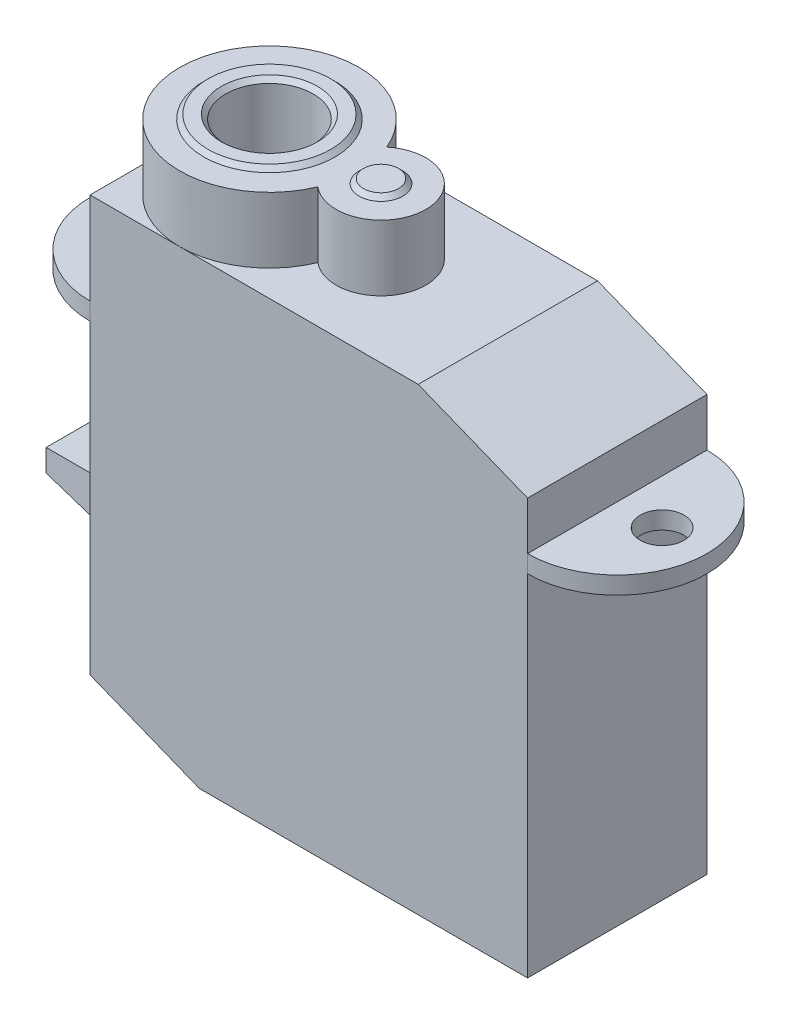
ISO-10303-21;
HEADER;
FILE_DESCRIPTION(('STEP AP214'),'2;1');
FILE_NAME('part.step','',(''),(''),'','','');
FILE_SCHEMA(('AUTOMOTIVE_DESIGN { 1 0 10303 214 1 1 1 1 }'));
ENDSEC;
DATA;
#1=APPLICATION_CONTEXT('core data for automotive mechanical design processes');
#2=APPLICATION_PROTOCOL_DEFINITION('international standard','automotive_design',2000,#1);
#3=PRODUCT_CONTEXT('',#1,'mechanical');
#4=PRODUCT('Part','Part','',(#3));
#5=PRODUCT_RELATED_PRODUCT_CATEGORY('part','',(#4));
#6=PRODUCT_DEFINITION_FORMATION('','',#4);
#7=PRODUCT_DEFINITION_CONTEXT('part definition',#1,'design');
#8=PRODUCT_DEFINITION('design','',#6,#7);
#9=PRODUCT_DEFINITION_SHAPE('','',#8);
#10=(LENGTH_UNIT() NAMED_UNIT(*) SI_UNIT(.MILLI.,.METRE.));
#11=(NAMED_UNIT(*) PLANE_ANGLE_UNIT() SI_UNIT($,.RADIAN.));
#12=(NAMED_UNIT(*) SI_UNIT($,.STERADIAN.) SOLID_ANGLE_UNIT());
#13=UNCERTAINTY_MEASURE_WITH_UNIT(LENGTH_MEASURE(1.E-05),#10,'distance_accuracy_value','');
#14=(GEOMETRIC_REPRESENTATION_CONTEXT(3) GLOBAL_UNCERTAINTY_ASSIGNED_CONTEXT((#13)) GLOBAL_UNIT_ASSIGNED_CONTEXT((#10,
#11,#12)) REPRESENTATION_CONTEXT('',''));
#15=CARTESIAN_POINT('',(0.,0.,0.));
#16=DIRECTION('',(0.,0.,1.));
#17=DIRECTION('',(1.,0.,0.));
#18=AXIS2_PLACEMENT_3D('',#15,#16,#17);
#19=CARTESIAN_POINT('',(6.65,24.,4.1));
#20=DIRECTION('',(0.,1.,0.));
#21=DIRECTION('',(0.,0.,1.));
#22=AXIS2_PLACEMENT_3D('',#19,#20,#21);
#23=PLANE('',#22);
#24=CARTESIAN_POINT('',(9.2,24.,4.1));
#25=DIRECTION('',(0.,1.,0.));
#26=DIRECTION('',(0.,0.,1.));
#27=AXIS2_PLACEMENT_3D('',#24,#25,#26);
#28=CIRCLE('',#27,1.);
#29=CARTESIAN_POINT('',(9.2,24.,5.1));
#30=VERTEX_POINT('',#29);
#31=EDGE_CURVE('E720',#30,#30,#28,.T.);
#32=ORIENTED_EDGE('',*,*,#31,.F.);
#33=EDGE_LOOP('',(#32));
#34=FACE_BOUND('',#33,.T.);
#35=CARTESIAN_POINT('',(9.2,24.,4.1));
#36=DIRECTION('',(0.,1.,0.));
#37=DIRECTION('',(0.,0.,1.));
#38=AXIS2_PLACEMENT_3D('',#35,#36,#37);
#39=CIRCLE('',#38,2.05);
#40=CARTESIAN_POINT('',(7.8860294117647,24.,5.67352511681657));
#41=VERTEX_POINT('',#40);
#42=CARTESIAN_POINT('',(7.8860294117647,24.,2.52647488318343));
#43=VERTEX_POINT('',#42);
#44=EDGE_CURVE('E204',#41,#43,#39,.T.);
#45=ORIENTED_EDGE('',*,*,#44,.T.);
#46=CARTESIAN_POINT('',(4.1,24.,4.1));
#47=DIRECTION('',(0.,1.,0.));
#48=DIRECTION('',(0.,0.,1.));
#49=AXIS2_PLACEMENT_3D('',#46,#47,#48);
#50=CIRCLE('',#49,4.1);
#51=EDGE_CURVE('E207',#43,#41,#50,.T.);
#52=ORIENTED_EDGE('',*,*,#51,.T.);
#53=EDGE_LOOP('',(#45,#52));
#54=FACE_BOUND('',#53,.T.);
#55=CARTESIAN_POINT('',(4.1,24.,4.1));
#56=DIRECTION('',(0.,1.,0.));
#57=DIRECTION('',(0.,0.,1.));
#58=AXIS2_PLACEMENT_3D('',#55,#56,#57);
#59=CIRCLE('',#58,3.);
#60=CARTESIAN_POINT('',(4.1,24.,7.1));
#61=VERTEX_POINT('',#60);
#62=EDGE_CURVE('E695',#61,#61,#59,.T.);
#63=ORIENTED_EDGE('',*,*,#62,.F.);
#64=EDGE_LOOP('',(#63));
#65=FACE_BOUND('',#64,.T.);
#66=ADVANCED_FACE('F36',(#34,#54,#65),#23,.T.);
#67=CARTESIAN_POINT('',(0.,21.,0.));
#68=DIRECTION('',(1.,0.,0.));
#69=DIRECTION('',(0.,0.,-1.));
#70=AXIS2_PLACEMENT_3D('',#67,#68,#69);
#71=PLANE('',#70);
#72=DIRECTION('',(0.,-1.,0.));
#73=VECTOR('',#72,1.);
#74=CARTESIAN_POINT('',(0.,21.,0.));
#75=LINE('',#74,#73);
#76=CARTESIAN_POINT('',(0.,16.,0.));
#77=VERTEX_POINT('',#76);
#78=CARTESIAN_POINT('',(0.,2.,0.));
#79=VERTEX_POINT('',#78);
#80=EDGE_CURVE('E284',#77,#79,#75,.T.);
#81=ORIENTED_EDGE('',*,*,#80,.T.);
#82=DIRECTION('',(0.,0.,1.));
#83=VECTOR('',#82,1.);
#84=CARTESIAN_POINT('',(0.,2.,-0.000999999999999265));
#85=LINE('',#84,#83);
#86=CARTESIAN_POINT('',(0.,2.,8.2));
#87=VERTEX_POINT('',#86);
#88=EDGE_CURVE('E197',#79,#87,#85,.T.);
#89=ORIENTED_EDGE('',*,*,#88,.T.);
#90=DIRECTION('',(0.,-1.,0.));
#91=VECTOR('',#90,1.);
#92=CARTESIAN_POINT('',(0.,21.,8.2));
#93=LINE('',#92,#91);
#94=CARTESIAN_POINT('',(0.,16.,8.2));
#95=VERTEX_POINT('',#94);
#96=EDGE_CURVE('E301',#95,#87,#93,.T.);
#97=ORIENTED_EDGE('',*,*,#96,.F.);
#98=DIRECTION('',(0.,0.,1.));
#99=VECTOR('',#98,1.);
#100=CARTESIAN_POINT('',(0.,16.,0.));
#101=LINE('',#100,#99);
#102=EDGE_CURVE('E257',#77,#95,#101,.T.);
#103=ORIENTED_EDGE('',*,*,#102,.F.);
#104=EDGE_LOOP('',(#81,#89,#97,#103));
#105=FACE_BOUND('',#104,.T.);
#106=DIRECTION('',(0.,1.,0.));
#107=VECTOR('',#106,1.);
#108=CARTESIAN_POINT('',(0.,7.,7.2));
#109=LINE('',#108,#107);
#110=CARTESIAN_POINT('',(0.,7.,7.2));
#111=VERTEX_POINT('',#110);
#112=CARTESIAN_POINT('',(0.,9.,7.2));
#113=VERTEX_POINT('',#112);
#114=EDGE_CURVE('E157',#111,#113,#109,.T.);
#115=ORIENTED_EDGE('',*,*,#114,.F.);
#116=DIRECTION('',(0.,0.,1.));
#117=VECTOR('',#116,1.);
#118=CARTESIAN_POINT('',(0.,7.,1.));
#119=LINE('',#118,#117);
#120=CARTESIAN_POINT('',(0.,7.,1.));
#121=VERTEX_POINT('',#120);
#122=EDGE_CURVE('E160',#121,#111,#119,.T.);
#123=ORIENTED_EDGE('',*,*,#122,.F.);
#124=DIRECTION('',(0.,-1.,0.));
#125=VECTOR('',#124,1.);
#126=CARTESIAN_POINT('',(0.,7.,1.));
#127=LINE('',#126,#125);
#128=CARTESIAN_POINT('',(0.,9.,1.));
#129=VERTEX_POINT('',#128);
#130=EDGE_CURVE('E59',#129,#121,#127,.T.);
#131=ORIENTED_EDGE('',*,*,#130,.F.);
#132=DIRECTION('',(0.,0.,-1.));
#133=VECTOR('',#132,1.);
#134=CARTESIAN_POINT('',(0.,9.,1.));
#135=LINE('',#134,#133);
#136=EDGE_CURVE('E54',#113,#129,#135,.T.);
#137=ORIENTED_EDGE('',*,*,#136,.F.);
#138=EDGE_LOOP('',(#115,#123,#131,#137));
#139=FACE_BOUND('',#138,.T.);
#140=ADVANCED_FACE('F159',(#105,#139),#71,.F.);
#141=CARTESIAN_POINT('',(0.,21.,0.));
#142=DIRECTION('',(0.,1.,0.));
#143=DIRECTION('',(0.,0.,1.));
#144=AXIS2_PLACEMENT_3D('',#141,#142,#143);
#145=PLANE('',#144);
#146=CARTESIAN_POINT('',(9.2,21.,4.1));
#147=DIRECTION('',(0.,1.,0.));
#148=DIRECTION('',(0.,0.,1.));
#149=AXIS2_PLACEMENT_3D('',#146,#147,#148);
#150=CIRCLE('',#149,2.05);
#151=CARTESIAN_POINT('',(7.8860294117647,21.,5.67352511681657));
#152=VERTEX_POINT('',#151);
#153=CARTESIAN_POINT('',(7.8860294117647,21.,2.52647488318343));
#154=VERTEX_POINT('',#153);
#155=EDGE_CURVE('E203',#152,#154,#150,.T.);
#156=ORIENTED_EDGE('',*,*,#155,.F.);
#157=CARTESIAN_POINT('',(4.1,21.,4.1));
#158=DIRECTION('',(0.,1.,0.));
#159=DIRECTION('',(0.,0.,1.));
#160=AXIS2_PLACEMENT_3D('',#157,#158,#159);
#161=CIRCLE('',#160,4.1);
#162=CARTESIAN_POINT('',(4.1,21.,8.2));
#163=VERTEX_POINT('',#162);
#164=EDGE_CURVE('E213',#163,#152,#161,.T.);
#165=ORIENTED_EDGE('',*,*,#164,.F.);
#166=DIRECTION('',(1.,0.,0.));
#167=VECTOR('',#166,1.);
#168=CARTESIAN_POINT('',(0.,21.,8.2));
#169=LINE('',#168,#167);
#170=CARTESIAN_POINT('',(15.,21.,8.2));
#171=VERTEX_POINT('',#170);
#172=EDGE_CURVE('E275',#163,#171,#169,.T.);
#173=ORIENTED_EDGE('',*,*,#172,.T.);
#174=DIRECTION('',(0.,0.,1.));
#175=VECTOR('',#174,1.);
#176=CARTESIAN_POINT('',(15.,21.,-0.000999999999999265));
#177=LINE('',#176,#175);
#178=CARTESIAN_POINT('',(15.,21.,0.));
#179=VERTEX_POINT('',#178);
#180=EDGE_CURVE('E253',#179,#171,#177,.T.);
#181=ORIENTED_EDGE('',*,*,#180,.F.);
#182=DIRECTION('',(-1.,0.,0.));
#183=VECTOR('',#182,1.);
#184=CARTESIAN_POINT('',(0.,21.,0.));
#185=LINE('',#184,#183);
#186=CARTESIAN_POINT('',(4.1,21.,0.));
#187=VERTEX_POINT('',#186);
#188=EDGE_CURVE('E281',#179,#187,#185,.T.);
#189=ORIENTED_EDGE('',*,*,#188,.T.);
#190=EDGE_CURVE('E47',#154,#187,#161,.T.);
#191=ORIENTED_EDGE('',*,*,#190,.F.);
#192=EDGE_LOOP('',(#156,#165,#173,#181,#189,#191));
#193=FACE_BOUND('',#192,.T.);
#194=ADVANCED_FACE('F344',(#193),#145,.T.);
#195=CARTESIAN_POINT('',(0.,21.,4.1));
#196=VERTEX_POINT('',#195);
#197=EDGE_CURVE('E11',#187,#196,#161,.T.);
#198=ORIENTED_EDGE('',*,*,#197,.F.);
#199=CARTESIAN_POINT('',(0.,21.,0.));
#200=VERTEX_POINT('',#199);
#201=EDGE_CURVE('E280',#187,#200,#185,.T.);
#202=ORIENTED_EDGE('',*,*,#201,.T.);
#203=DIRECTION('',(0.,0.,1.));
#204=VECTOR('',#203,1.);
#205=CARTESIAN_POINT('',(0.,21.,0.));
#206=LINE('',#205,#204);
#207=EDGE_CURVE('E272',#200,#196,#206,.T.);
#208=ORIENTED_EDGE('',*,*,#207,.T.);
#209=EDGE_LOOP('',(#198,#202,#208));
#210=FACE_BOUND('',#209,.T.);
#211=ADVANCED_FACE('F590',(#210),#145,.T.);
#212=CARTESIAN_POINT('',(0.,21.,8.2));
#213=DIRECTION('',(0.,0.,-1.));
#214=DIRECTION('',(-1.,0.,0.));
#215=AXIS2_PLACEMENT_3D('',#212,#213,#214);
#216=PLANE('',#215);
#217=ORIENTED_EDGE('',*,*,#96,.T.);
#218=DIRECTION('',(-0.928476690885259,0.371390676354104,0.));
#219=VECTOR('',#218,1.);
#220=CARTESIAN_POINT('',(0.,2.,8.2));
#221=LINE('',#220,#219);
#222=CARTESIAN_POINT('',(5.,0.,8.2));
#223=VERTEX_POINT('',#222);
#224=EDGE_CURVE('E194',#223,#87,#221,.T.);
#225=ORIENTED_EDGE('',*,*,#224,.F.);
#226=DIRECTION('',(1.,0.,0.));
#227=VECTOR('',#226,1.);
#228=CARTESIAN_POINT('',(0.,0.,8.2));
#229=LINE('',#228,#227);
#230=CARTESIAN_POINT('',(20.,0.,8.2));
#231=VERTEX_POINT('',#230);
#232=EDGE_CURVE('E271',#223,#231,#229,.T.);
#233=ORIENTED_EDGE('',*,*,#232,.T.);
#234=DIRECTION('',(0.,-1.,0.));
#235=VECTOR('',#234,1.);
#236=CARTESIAN_POINT('',(20.,21.,8.2));
#237=LINE('',#236,#235);
#238=CARTESIAN_POINT('',(20.,16.,8.2));
#239=VERTEX_POINT('',#238);
#240=EDGE_CURVE('E298',#239,#231,#237,.T.);
#241=ORIENTED_EDGE('',*,*,#240,.F.);
#242=DIRECTION('',(0.,1.,0.));
#243=VECTOR('',#242,1.);
#244=CARTESIAN_POINT('',(20.,-0.001000000000001,8.2));
#245=LINE('',#244,#243);
#246=CARTESIAN_POINT('',(20.,16.8,8.2));
#247=VERTEX_POINT('',#246);
#248=EDGE_CURVE('E246',#239,#247,#245,.T.);
#249=ORIENTED_EDGE('',*,*,#248,.T.);
#250=CARTESIAN_POINT('',(20.,19.,8.2));
#251=VERTEX_POINT('',#250);
#252=EDGE_CURVE('E299',#251,#247,#237,.T.);
#253=ORIENTED_EDGE('',*,*,#252,.F.);
#254=DIRECTION('',(0.92847669088526,-0.371390676354103,0.));
#255=VECTOR('',#254,1.);
#256=CARTESIAN_POINT('',(20.,19.,8.2));
#257=LINE('',#256,#255);
#258=EDGE_CURVE('E251',#171,#251,#257,.T.);
#259=ORIENTED_EDGE('',*,*,#258,.F.);
#260=ORIENTED_EDGE('',*,*,#172,.F.);
#261=CARTESIAN_POINT('',(0.,21.,8.2));
#262=VERTEX_POINT('',#261);
#263=EDGE_CURVE('E277',#262,#163,#169,.T.);
#264=ORIENTED_EDGE('',*,*,#263,.F.);
#265=CARTESIAN_POINT('',(0.,16.8,8.2));
#266=VERTEX_POINT('',#265);
#267=EDGE_CURVE('E40',#262,#266,#93,.T.);
#268=ORIENTED_EDGE('',*,*,#267,.T.);
#269=DIRECTION('',(0.,1.,0.));
#270=VECTOR('',#269,1.);
#271=CARTESIAN_POINT('',(0.,-0.001000000000001,8.2));
#272=LINE('',#271,#270);
#273=EDGE_CURVE('E238',#95,#266,#272,.T.);
#274=ORIENTED_EDGE('',*,*,#273,.F.);
#275=EDGE_LOOP('',(#217,#225,#233,#241,#249,#253,#259,#260,#264,#268,#274));
#276=FACE_BOUND('',#275,.T.);
#277=ADVANCED_FACE('F331',(#276),#216,.F.);
#278=CARTESIAN_POINT('',(0.,21.,0.));
#279=DIRECTION('',(0.,0.,1.));
#280=DIRECTION('',(1.,0.,0.));
#281=AXIS2_PLACEMENT_3D('',#278,#279,#280);
#282=PLANE('',#281);
#283=DIRECTION('',(-1.,0.,0.));
#284=VECTOR('',#283,1.);
#285=CARTESIAN_POINT('',(0.,0.,0.));
#286=LINE('',#285,#284);
#287=CARTESIAN_POINT('',(20.,0.,0.));
#288=VERTEX_POINT('',#287);
#289=CARTESIAN_POINT('',(5.,0.,0.));
#290=VERTEX_POINT('',#289);
#291=EDGE_CURVE('E289',#288,#290,#286,.T.);
#292=ORIENTED_EDGE('',*,*,#291,.T.);
#293=DIRECTION('',(0.92847669088526,-0.371390676354104,0.));
#294=VECTOR('',#293,1.);
#295=CARTESIAN_POINT('',(0.,2.,0.));
#296=LINE('',#295,#294);
#297=EDGE_CURVE('E200',#79,#290,#296,.T.);
#298=ORIENTED_EDGE('',*,*,#297,.F.);
#299=ORIENTED_EDGE('',*,*,#80,.F.);
#300=DIRECTION('',(0.,1.,0.));
#301=VECTOR('',#300,1.);
#302=CARTESIAN_POINT('',(0.,-0.001000000000001,0.));
#303=LINE('',#302,#301);
#304=CARTESIAN_POINT('',(0.,16.8,0.));
#305=VERTEX_POINT('',#304);
#306=EDGE_CURVE('E237',#77,#305,#303,.T.);
#307=ORIENTED_EDGE('',*,*,#306,.T.);
#308=EDGE_CURVE('E292',#200,#305,#75,.T.);
#309=ORIENTED_EDGE('',*,*,#308,.F.);
#310=ORIENTED_EDGE('',*,*,#201,.F.);
#311=ORIENTED_EDGE('',*,*,#188,.F.);
#312=DIRECTION('',(-0.92847669088526,0.371390676354103,0.));
#313=VECTOR('',#312,1.);
#314=CARTESIAN_POINT('',(20.,19.,0.));
#315=LINE('',#314,#313);
#316=CARTESIAN_POINT('',(20.,19.,0.));
#317=VERTEX_POINT('',#316);
#318=EDGE_CURVE('E240',#317,#179,#315,.T.);
#319=ORIENTED_EDGE('',*,*,#318,.F.);
#320=DIRECTION('',(0.,-1.,0.));
#321=VECTOR('',#320,1.);
#322=CARTESIAN_POINT('',(20.,21.,0.));
#323=LINE('',#322,#321);
#324=CARTESIAN_POINT('',(20.,16.8,0.));
#325=VERTEX_POINT('',#324);
#326=EDGE_CURVE('E296',#317,#325,#323,.T.);
#327=ORIENTED_EDGE('',*,*,#326,.T.);
#328=DIRECTION('',(0.,1.,0.));
#329=VECTOR('',#328,1.);
#330=CARTESIAN_POINT('',(20.,-0.001000000000001,0.));
#331=LINE('',#330,#329);
#332=CARTESIAN_POINT('',(20.,16.,0.));
#333=VERTEX_POINT('',#332);
#334=EDGE_CURVE('E235',#333,#325,#331,.T.);
#335=ORIENTED_EDGE('',*,*,#334,.F.);
#336=EDGE_CURVE('E295',#333,#288,#323,.T.);
#337=ORIENTED_EDGE('',*,*,#336,.T.);
#338=EDGE_LOOP('',(#292,#298,#299,#307,#309,#310,#311,#319,#327,#335,#337));
#339=FACE_BOUND('',#338,.T.);
#340=ADVANCED_FACE('F321',(#339),#282,.F.);
#341=DIRECTION('',(0.,0.,-1.));
#342=VECTOR('',#341,1.);
#343=CARTESIAN_POINT('',(0.,16.8,0.));
#344=LINE('',#343,#342);
#345=EDGE_CURVE('E262',#266,#305,#344,.T.);
#346=ORIENTED_EDGE('',*,*,#345,.F.);
#347=ORIENTED_EDGE('',*,*,#267,.F.);
#348=EDGE_CURVE('E276',#196,#262,#206,.T.);
#349=ORIENTED_EDGE('',*,*,#348,.F.);
#350=ORIENTED_EDGE('',*,*,#207,.F.);
#351=ORIENTED_EDGE('',*,*,#308,.T.);
#352=EDGE_LOOP('',(#346,#347,#349,#350,#351));
#353=FACE_BOUND('',#352,.T.);
#354=ADVANCED_FACE('F38',(#353),#71,.F.);
#355=CARTESIAN_POINT('',(20.,21.,0.));
#356=DIRECTION('',(-1.,0.,0.));
#357=DIRECTION('',(0.,0.,1.));
#358=AXIS2_PLACEMENT_3D('',#355,#356,#357);
#359=PLANE('',#358);
#360=DIRECTION('',(0.,0.,-1.));
#361=VECTOR('',#360,1.);
#362=CARTESIAN_POINT('',(20.,16.,8.2));
#363=LINE('',#362,#361);
#364=EDGE_CURVE('E265',#239,#333,#363,.T.);
#365=ORIENTED_EDGE('',*,*,#364,.F.);
#366=ORIENTED_EDGE('',*,*,#240,.T.);
#367=DIRECTION('',(0.,0.,-1.));
#368=VECTOR('',#367,1.);
#369=CARTESIAN_POINT('',(20.,0.,0.));
#370=LINE('',#369,#368);
#371=EDGE_CURVE('E286',#231,#288,#370,.T.);
#372=ORIENTED_EDGE('',*,*,#371,.T.);
#373=ORIENTED_EDGE('',*,*,#336,.F.);
#374=EDGE_LOOP('',(#365,#366,#372,#373));
#375=FACE_BOUND('',#374,.T.);
#376=ADVANCED_FACE('F311',(#375),#359,.F.);
#377=ORIENTED_EDGE('',*,*,#326,.F.);
#378=DIRECTION('',(0.,0.,1.));
#379=VECTOR('',#378,1.);
#380=CARTESIAN_POINT('',(20.,19.,-0.000999999999999265));
#381=LINE('',#380,#379);
#382=EDGE_CURVE('E254',#317,#251,#381,.T.);
#383=ORIENTED_EDGE('',*,*,#382,.T.);
#384=ORIENTED_EDGE('',*,*,#252,.T.);
#385=DIRECTION('',(0.,0.,-1.));
#386=VECTOR('',#385,1.);
#387=CARTESIAN_POINT('',(20.,16.8,8.2));
#388=LINE('',#387,#386);
#389=EDGE_CURVE('E268',#247,#325,#388,.T.);
#390=ORIENTED_EDGE('',*,*,#389,.T.);
#391=EDGE_LOOP('',(#377,#383,#384,#390));
#392=FACE_BOUND('',#391,.T.);
#393=ADVANCED_FACE('F340',(#392),#359,.F.);
#394=EDGE_CURVE('E45',#196,#163,#161,.T.);
#395=ORIENTED_EDGE('',*,*,#394,.F.);
#396=ORIENTED_EDGE('',*,*,#348,.T.);
#397=ORIENTED_EDGE('',*,*,#263,.T.);
#398=EDGE_LOOP('',(#395,#396,#397));
#399=FACE_BOUND('',#398,.T.);
#400=ADVANCED_FACE('F592',(#399),#145,.T.);
#401=CARTESIAN_POINT('',(0.,0.,0.));
#402=DIRECTION('',(0.,1.,0.));
#403=DIRECTION('',(0.,0.,1.));
#404=AXIS2_PLACEMENT_3D('',#401,#402,#403);
#405=PLANE('',#404);
#406=ORIENTED_EDGE('',*,*,#232,.F.);
#407=DIRECTION('',(0.,0.,1.));
#408=VECTOR('',#407,1.);
#409=CARTESIAN_POINT('',(5.,0.,-0.000999999999999265));
#410=LINE('',#409,#408);
#411=EDGE_CURVE('E196',#290,#223,#410,.T.);
#412=ORIENTED_EDGE('',*,*,#411,.F.);
#413=ORIENTED_EDGE('',*,*,#291,.F.);
#414=ORIENTED_EDGE('',*,*,#371,.F.);
#415=EDGE_LOOP('',(#406,#412,#413,#414));
#416=FACE_BOUND('',#415,.T.);
#417=ADVANCED_FACE('F317',(#416),#405,.F.);
#418=CARTESIAN_POINT('',(25.,16.,8.2));
#419=DIRECTION('',(0.,1.,0.));
#420=DIRECTION('',(0.,0.,1.));
#421=AXIS2_PLACEMENT_3D('',#418,#419,#420);
#422=PLANE('',#421);
#423=CARTESIAN_POINT('',(22.05,16.,4.1));
#424=DIRECTION('',(0.,1.,0.));
#425=DIRECTION('',(0.,0.,1.));
#426=AXIS2_PLACEMENT_3D('',#423,#424,#425);
#427=CIRCLE('',#426,1.);
#428=CARTESIAN_POINT('',(22.05,16.,5.1));
#429=VERTEX_POINT('',#428);
#430=EDGE_CURVE('E228',#429,#429,#427,.T.);
#431=ORIENTED_EDGE('',*,*,#430,.T.);
#432=EDGE_LOOP('',(#431));
#433=FACE_BOUND('',#432,.T.);
#434=ORIENTED_EDGE('',*,*,#364,.T.);
#435=CARTESIAN_POINT('',(20.,16.,4.1));
#436=DIRECTION('',(0.,1.,0.));
#437=DIRECTION('',(0.,0.,1.));
#438=AXIS2_PLACEMENT_3D('',#435,#436,#437);
#439=CIRCLE('',#438,4.1);
#440=EDGE_CURVE('E231',#239,#333,#439,.T.);
#441=ORIENTED_EDGE('',*,*,#440,.F.);
#442=EDGE_LOOP('',(#434,#441));
#443=FACE_BOUND('',#442,.T.);
#444=ADVANCED_FACE('F327',(#433,#443),#422,.F.);
#445=CARTESIAN_POINT('',(25.,16.8,8.2));
#446=DIRECTION('',(0.,1.,0.));
#447=DIRECTION('',(0.,0.,1.));
#448=AXIS2_PLACEMENT_3D('',#445,#446,#447);
#449=PLANE('',#448);
#450=CARTESIAN_POINT('',(22.05,16.8,4.1));
#451=DIRECTION('',(0.,1.,0.));
#452=DIRECTION('',(0.,0.,1.));
#453=AXIS2_PLACEMENT_3D('',#450,#451,#452);
#454=CIRCLE('',#453,1.);
#455=CARTESIAN_POINT('',(22.05,16.8,5.1));
#456=VERTEX_POINT('',#455);
#457=EDGE_CURVE('E225',#456,#456,#454,.T.);
#458=ORIENTED_EDGE('',*,*,#457,.F.);
#459=EDGE_LOOP('',(#458));
#460=FACE_BOUND('',#459,.T.);
#461=CARTESIAN_POINT('',(20.,16.8,4.1));
#462=DIRECTION('',(0.,-1.,0.));
#463=DIRECTION('',(0.,0.,1.));
#464=AXIS2_PLACEMENT_3D('',#461,#462,#463);
#465=CIRCLE('',#464,4.1);
#466=EDGE_CURVE('E244',#325,#247,#465,.T.);
#467=ORIENTED_EDGE('',*,*,#466,.F.);
#468=ORIENTED_EDGE('',*,*,#389,.F.);
#469=EDGE_LOOP('',(#467,#468));
#470=FACE_BOUND('',#469,.T.);
#471=ADVANCED_FACE('F369',(#460,#470),#449,.T.);
#472=CARTESIAN_POINT('',(-5.,16.,0.));
#473=DIRECTION('',(0.,1.,0.));
#474=DIRECTION('',(0.,0.,1.));
#475=AXIS2_PLACEMENT_3D('',#472,#473,#474);
#476=PLANE('',#475);
#477=CARTESIAN_POINT('',(-2.05,16.,4.1));
#478=DIRECTION('',(0.,1.,0.));
#479=DIRECTION('',(0.,0.,1.));
#480=AXIS2_PLACEMENT_3D('',#477,#478,#479);
#481=CIRCLE('',#480,1.);
#482=CARTESIAN_POINT('',(-2.05,16.,5.1));
#483=VERTEX_POINT('',#482);
#484=EDGE_CURVE('E222',#483,#483,#481,.T.);
#485=ORIENTED_EDGE('',*,*,#484,.T.);
#486=EDGE_LOOP('',(#485));
#487=FACE_BOUND('',#486,.T.);
#488=ORIENTED_EDGE('',*,*,#102,.T.);
#489=CARTESIAN_POINT('',(0.,16.,4.1));
#490=DIRECTION('',(0.,1.,0.));
#491=DIRECTION('',(0.,0.,1.));
#492=AXIS2_PLACEMENT_3D('',#489,#490,#491);
#493=CIRCLE('',#492,4.1);
#494=EDGE_CURVE('E232',#77,#95,#493,.T.);
#495=ORIENTED_EDGE('',*,*,#494,.F.);
#496=EDGE_LOOP('',(#488,#495));
#497=FACE_BOUND('',#496,.T.);
#498=ADVANCED_FACE('F367',(#487,#497),#476,.F.);
#499=CARTESIAN_POINT('',(-5.,16.8,0.));
#500=DIRECTION('',(0.,-1.,0.));
#501=DIRECTION('',(0.,0.,-1.));
#502=AXIS2_PLACEMENT_3D('',#499,#500,#501);
#503=PLANE('',#502);
#504=CARTESIAN_POINT('',(-2.05,16.8,4.1));
#505=DIRECTION('',(0.,1.,0.));
#506=DIRECTION('',(0.,0.,1.));
#507=AXIS2_PLACEMENT_3D('',#504,#505,#506);
#508=CIRCLE('',#507,1.);
#509=CARTESIAN_POINT('',(-2.05,16.8,5.1));
#510=VERTEX_POINT('',#509);
#511=EDGE_CURVE('E219',#510,#510,#508,.T.);
#512=ORIENTED_EDGE('',*,*,#511,.F.);
#513=EDGE_LOOP('',(#512));
#514=FACE_BOUND('',#513,.T.);
#515=ORIENTED_EDGE('',*,*,#345,.T.);
#516=CARTESIAN_POINT('',(0.,16.8,4.1));
#517=DIRECTION('',(0.,-1.,0.));
#518=DIRECTION('',(0.,0.,1.));
#519=AXIS2_PLACEMENT_3D('',#516,#517,#518);
#520=CIRCLE('',#519,4.1);
#521=EDGE_CURVE('E234',#266,#305,#520,.T.);
#522=ORIENTED_EDGE('',*,*,#521,.F.);
#523=EDGE_LOOP('',(#515,#522));
#524=FACE_BOUND('',#523,.T.);
#525=ADVANCED_FACE('F360',(#514,#524),#503,.F.);
#526=CARTESIAN_POINT('',(20.,19.,-0.000999999999999265));
#527=DIRECTION('',(-0.371390676354103,-0.928476690885259,0.));
#528=DIRECTION('',(0.92847669088526,-0.371390676354103,0.));
#529=AXIS2_PLACEMENT_3D('',#526,#527,#528);
#530=PLANE('',#529);
#531=ORIENTED_EDGE('',*,*,#318,.T.);
#532=ORIENTED_EDGE('',*,*,#180,.T.);
#533=ORIENTED_EDGE('',*,*,#258,.T.);
#534=ORIENTED_EDGE('',*,*,#382,.F.);
#535=EDGE_LOOP('',(#531,#532,#533,#534));
#536=FACE_BOUND('',#535,.T.);
#537=ADVANCED_FACE('F336',(#536),#530,.F.);
#538=CARTESIAN_POINT('',(0.,-0.001000000000001,4.1));
#539=DIRECTION('',(0.,1.,0.));
#540=DIRECTION('',(0.,0.,1.));
#541=AXIS2_PLACEMENT_3D('',#538,#539,#540);
#542=CYLINDRICAL_SURFACE('',#541,4.1);
#543=ORIENTED_EDGE('',*,*,#494,.T.);
#544=ORIENTED_EDGE('',*,*,#273,.T.);
#545=ORIENTED_EDGE('',*,*,#521,.T.);
#546=ORIENTED_EDGE('',*,*,#306,.F.);
#547=EDGE_LOOP('',(#543,#544,#545,#546));
#548=FACE_BOUND('',#547,.T.);
#549=ADVANCED_FACE('F362',(#548),#542,.T.);
#550=CARTESIAN_POINT('',(20.,-0.001000000000001,4.1));
#551=DIRECTION('',(0.,1.,0.));
#552=DIRECTION('',(0.,0.,1.));
#553=AXIS2_PLACEMENT_3D('',#550,#551,#552);
#554=CYLINDRICAL_SURFACE('',#553,4.1);
#555=ORIENTED_EDGE('',*,*,#440,.T.);
#556=ORIENTED_EDGE('',*,*,#334,.T.);
#557=ORIENTED_EDGE('',*,*,#466,.T.);
#558=ORIENTED_EDGE('',*,*,#248,.F.);
#559=EDGE_LOOP('',(#555,#556,#557,#558));
#560=FACE_BOUND('',#559,.T.);
#561=ADVANCED_FACE('F329',(#560),#554,.T.);
#562=CARTESIAN_POINT('',(22.05,16.8,4.1));
#563=DIRECTION('',(0.,1.,0.));
#564=DIRECTION('',(0.,0.,1.));
#565=AXIS2_PLACEMENT_3D('',#562,#563,#564);
#566=CYLINDRICAL_SURFACE('',#565,1.);
#567=ORIENTED_EDGE('',*,*,#430,.F.);
#568=EDGE_LOOP('',(#567));
#569=FACE_BOUND('',#568,.T.);
#570=ORIENTED_EDGE('',*,*,#457,.T.);
#571=EDGE_LOOP('',(#570));
#572=FACE_BOUND('',#571,.T.);
#573=ADVANCED_FACE('F402',(#569,#572),#566,.F.);
#574=CARTESIAN_POINT('',(-2.05,16.8,4.1));
#575=DIRECTION('',(0.,1.,0.));
#576=DIRECTION('',(0.,0.,1.));
#577=AXIS2_PLACEMENT_3D('',#574,#575,#576);
#578=CYLINDRICAL_SURFACE('',#577,1.);
#579=ORIENTED_EDGE('',*,*,#484,.F.);
#580=EDGE_LOOP('',(#579));
#581=FACE_BOUND('',#580,.T.);
#582=ORIENTED_EDGE('',*,*,#511,.T.);
#583=EDGE_LOOP('',(#582));
#584=FACE_BOUND('',#583,.T.);
#585=ADVANCED_FACE('F398',(#581,#584),#578,.F.);
#586=CARTESIAN_POINT('',(9.2,24.,4.1));
#587=DIRECTION('',(0.,-1.,0.));
#588=DIRECTION('',(0.,0.,-1.));
#589=AXIS2_PLACEMENT_3D('',#586,#587,#588);
#590=CYLINDRICAL_SURFACE('',#589,2.05);
#591=ORIENTED_EDGE('',*,*,#155,.T.);
#592=DIRECTION('',(0.,-1.,0.));
#593=VECTOR('',#592,1.);
#594=CARTESIAN_POINT('',(7.8860294117647,24.,2.52647488318343));
#595=LINE('',#594,#593);
#596=EDGE_CURVE('E216',#43,#154,#595,.T.);
#597=ORIENTED_EDGE('',*,*,#596,.F.);
#598=ORIENTED_EDGE('',*,*,#44,.F.);
#599=DIRECTION('',(0.,-1.,0.));
#600=VECTOR('',#599,1.);
#601=CARTESIAN_POINT('',(7.8860294117647,24.,5.67352511681657));
#602=LINE('',#601,#600);
#603=EDGE_CURVE('E209',#41,#152,#602,.T.);
#604=ORIENTED_EDGE('',*,*,#603,.T.);
#605=EDGE_LOOP('',(#591,#597,#598,#604));
#606=FACE_BOUND('',#605,.T.);
#607=ADVANCED_FACE('F395',(#606),#590,.T.);
#608=CARTESIAN_POINT('',(4.1,24.,4.1));
#609=DIRECTION('',(0.,-1.,0.));
#610=DIRECTION('',(0.,0.,-1.));
#611=AXIS2_PLACEMENT_3D('',#608,#609,#610);
#612=CYLINDRICAL_SURFACE('',#611,4.1);
#613=ORIENTED_EDGE('',*,*,#190,.T.);
#614=ORIENTED_EDGE('',*,*,#197,.T.);
#615=ORIENTED_EDGE('',*,*,#394,.T.);
#616=ORIENTED_EDGE('',*,*,#164,.T.);
#617=ORIENTED_EDGE('',*,*,#603,.F.);
#618=ORIENTED_EDGE('',*,*,#51,.F.);
#619=ORIENTED_EDGE('',*,*,#596,.T.);
#620=EDGE_LOOP('',(#613,#614,#615,#616,#617,#618,#619));
#621=FACE_BOUND('',#620,.T.);
#622=ADVANCED_FACE('F392',(#621),#612,.T.);
#623=CARTESIAN_POINT('',(0.,2.,-0.000999999999999265));
#624=DIRECTION('',(0.371390676354104,0.928476690885259,0.));
#625=DIRECTION('',(-0.928476690885259,0.371390676354104,0.));
#626=AXIS2_PLACEMENT_3D('',#623,#624,#625);
#627=PLANE('',#626);
#628=ORIENTED_EDGE('',*,*,#297,.T.);
#629=ORIENTED_EDGE('',*,*,#411,.T.);
#630=ORIENTED_EDGE('',*,*,#224,.T.);
#631=ORIENTED_EDGE('',*,*,#88,.F.);
#632=EDGE_LOOP('',(#628,#629,#630,#631));
#633=FACE_BOUND('',#632,.T.);
#634=ADVANCED_FACE('F390',(#633),#627,.F.);
#635=CARTESIAN_POINT('',(0.,7.,7.2));
#636=DIRECTION('',(-0.139173100960066,0.,0.99026806874157));
#637=DIRECTION('',(0.99026806874157,0.,0.139173100960066));
#638=AXIS2_PLACEMENT_3D('',#635,#636,#637);
#639=PLANE('',#638);
#640=ORIENTED_EDGE('',*,*,#114,.T.);
#641=DIRECTION('',(0.980814848463989,0.137844537491629,0.137844537491629));
#642=VECTOR('',#641,1.);
#643=CARTESIAN_POINT('',(-0.838239808738931,8.88219307759906,7.08219307759906));
#644=LINE('',#643,#642);
#645=CARTESIAN_POINT('',(-3.5,8.50810707854163,6.70810707854163));
#646=VERTEX_POINT('',#645);
#647=EDGE_CURVE('E186',#646,#113,#644,.T.);
#648=ORIENTED_EDGE('',*,*,#647,.F.);
#649=DIRECTION('',(0.,-1.,0.));
#650=VECTOR('',#649,1.);
#651=CARTESIAN_POINT('',(-3.5,0.,6.70810707854163));
#652=LINE('',#651,#650);
#653=CARTESIAN_POINT('',(-3.5,7.49189292145837,6.70810707854163));
#654=VERTEX_POINT('',#653);
#655=EDGE_CURVE('E175',#654,#646,#652,.F.);
#656=ORIENTED_EDGE('',*,*,#655,.F.);
#657=DIRECTION('',(0.980814848463989,-0.137844537491629,0.137844537491629));
#658=VECTOR('',#657,1.);
#659=CARTESIAN_POINT('',(0.,7.,7.2));
#660=LINE('',#659,#658);
#661=EDGE_CURVE('E171',#654,#111,#660,.T.);
#662=ORIENTED_EDGE('',*,*,#661,.T.);
#663=EDGE_LOOP('',(#640,#648,#656,#662));
#664=FACE_BOUND('',#663,.T.);
#665=ADVANCED_FACE('F177',(#664),#639,.T.);
#666=CARTESIAN_POINT('',(0.,9.,1.));
#667=DIRECTION('',(-0.139173100960066,0.99026806874157,0.));
#668=DIRECTION('',(-0.99026806874157,-0.139173100960066,0.));
#669=AXIS2_PLACEMENT_3D('',#666,#667,#668);
#670=PLANE('',#669);
#671=ORIENTED_EDGE('',*,*,#136,.T.);
#672=DIRECTION('',(0.980814848463989,0.137844537491629,-0.137844537491629));
#673=VECTOR('',#672,1.);
#674=CARTESIAN_POINT('',(-0.270399938302881,8.96199776696744,1.03800223303256));
#675=LINE('',#674,#673);
#676=CARTESIAN_POINT('',(-3.5,8.50810707854163,1.49189292145837));
#677=VERTEX_POINT('',#676);
#678=EDGE_CURVE('E181',#677,#129,#675,.T.);
#679=ORIENTED_EDGE('',*,*,#678,.F.);
#680=DIRECTION('',(0.,0.,1.));
#681=VECTOR('',#680,1.);
#682=CARTESIAN_POINT('',(-3.5,8.50810707854163,0.));
#683=LINE('',#682,#681);
#684=EDGE_CURVE('E191',#646,#677,#683,.F.);
#685=ORIENTED_EDGE('',*,*,#684,.F.);
#686=ORIENTED_EDGE('',*,*,#647,.T.);
#687=EDGE_LOOP('',(#671,#679,#685,#686));
#688=FACE_BOUND('',#687,.T.);
#689=ADVANCED_FACE('F460',(#688),#670,.T.);
#690=CARTESIAN_POINT('',(0.,7.,1.));
#691=DIRECTION('',(-0.139173100960066,0.,-0.99026806874157));
#692=DIRECTION('',(-0.99026806874157,0.,0.139173100960066));
#693=AXIS2_PLACEMENT_3D('',#690,#691,#692);
#694=PLANE('',#693);
#695=ORIENTED_EDGE('',*,*,#130,.T.);
#696=DIRECTION('',(0.980814848463989,-0.137844537491629,-0.137844537491629));
#697=VECTOR('',#696,1.);
#698=CARTESIAN_POINT('',(0.,7.,1.));
#699=LINE('',#698,#697);
#700=CARTESIAN_POINT('',(-3.5,7.49189292145837,1.49189292145837));
#701=VERTEX_POINT('',#700);
#702=EDGE_CURVE('E174',#701,#121,#699,.T.);
#703=ORIENTED_EDGE('',*,*,#702,.F.);
#704=DIRECTION('',(0.,1.,0.));
#705=VECTOR('',#704,1.);
#706=CARTESIAN_POINT('',(-3.5,0.,1.49189292145837));
#707=LINE('',#706,#705);
#708=EDGE_CURVE('E183',#677,#701,#707,.F.);
#709=ORIENTED_EDGE('',*,*,#708,.F.);
#710=ORIENTED_EDGE('',*,*,#678,.T.);
#711=EDGE_LOOP('',(#695,#703,#709,#710));
#712=FACE_BOUND('',#711,.T.);
#713=ADVANCED_FACE('F467',(#712),#694,.T.);
#714=CARTESIAN_POINT('',(0.,7.,1.));
#715=DIRECTION('',(-0.139173100960066,-0.99026806874157,0.));
#716=DIRECTION('',(0.99026806874157,-0.139173100960066,0.));
#717=AXIS2_PLACEMENT_3D('',#714,#715,#716);
#718=PLANE('',#717);
#719=ORIENTED_EDGE('',*,*,#122,.T.);
#720=ORIENTED_EDGE('',*,*,#661,.F.);
#721=DIRECTION('',(0.,0.,-1.));
#722=VECTOR('',#721,1.);
#723=CARTESIAN_POINT('',(-3.5,7.49189292145837,0.));
#724=LINE('',#723,#722);
#725=EDGE_CURVE('E179',#701,#654,#724,.F.);
#726=ORIENTED_EDGE('',*,*,#725,.F.);
#727=ORIENTED_EDGE('',*,*,#702,.T.);
#728=EDGE_LOOP('',(#719,#720,#726,#727));
#729=FACE_BOUND('',#728,.T.);
#730=ADVANCED_FACE('F169',(#729),#718,.T.);
#731=CARTESIAN_POINT('',(-3.5,0.,0.));
#732=DIRECTION('',(1.,0.,0.));
#733=DIRECTION('',(0.,0.,-1.));
#734=AXIS2_PLACEMENT_3D('',#731,#732,#733);
#735=PLANE('',#734);
#736=ORIENTED_EDGE('',*,*,#655,.T.);
#737=ORIENTED_EDGE('',*,*,#684,.T.);
#738=ORIENTED_EDGE('',*,*,#708,.T.);
#739=ORIENTED_EDGE('',*,*,#725,.T.);
#740=EDGE_LOOP('',(#736,#737,#738,#739));
#741=FACE_BOUND('',#740,.T.);
#742=ADVANCED_FACE('F481',(#741),#735,.F.);
#743=CARTESIAN_POINT('',(4.1,24.2,4.1));
#744=DIRECTION('',(0.,1.,0.));
#745=DIRECTION('',(0.,0.,1.));
#746=AXIS2_PLACEMENT_3D('',#743,#744,#745);
#747=PLANE('',#746);
#748=CARTESIAN_POINT('',(4.1,24.2,4.1));
#749=DIRECTION('',(0.,1.,0.));
#750=DIRECTION('',(0.,0.,1.));
#751=AXIS2_PLACEMENT_3D('',#748,#749,#750);
#752=CIRCLE('',#751,2.8);
#753=CARTESIAN_POINT('',(4.1,24.2,6.9));
#754=VERTEX_POINT('',#753);
#755=EDGE_CURVE('E697',#754,#754,#752,.T.);
#756=ORIENTED_EDGE('',*,*,#755,.T.);
#757=EDGE_LOOP('',(#756));
#758=FACE_BOUND('',#757,.T.);
#759=CARTESIAN_POINT('',(4.1,24.2,4.1));
#760=DIRECTION('',(0.,1.,0.));
#761=DIRECTION('',(0.,0.,1.));
#762=AXIS2_PLACEMENT_3D('',#759,#760,#761);
#763=CIRCLE('',#762,2.2);
#764=CARTESIAN_POINT('',(4.1,24.2,6.3));
#765=VERTEX_POINT('',#764);
#766=EDGE_CURVE('E698',#765,#765,#763,.T.);
#767=ORIENTED_EDGE('',*,*,#766,.F.);
#768=EDGE_LOOP('',(#767));
#769=FACE_BOUND('',#768,.T.);
#770=ADVANCED_FACE('F488',(#758,#769),#747,.T.);
#771=CARTESIAN_POINT('',(4.1,24.,4.1));
#772=DIRECTION('',(0.,-1.,0.));
#773=DIRECTION('',(0.,0.,1.));
#774=AXIS2_PLACEMENT_3D('',#771,#772,#773);
#775=CONICAL_SURFACE('',#774,3.,0.78539816339745);
#776=ORIENTED_EDGE('',*,*,#755,.F.);
#777=EDGE_LOOP('',(#776));
#778=FACE_BOUND('',#777,.T.);
#779=ORIENTED_EDGE('',*,*,#62,.T.);
#780=EDGE_LOOP('',(#779));
#781=FACE_BOUND('',#780,.T.);
#782=ADVANCED_FACE('F497',(#778,#781),#775,.T.);
#783=CARTESIAN_POINT('',(4.1,24.,4.1));
#784=DIRECTION('',(0.,1.,0.));
#785=DIRECTION('',(0.,0.,1.));
#786=AXIS2_PLACEMENT_3D('',#783,#784,#785);
#787=CONICAL_SURFACE('',#786,2.,0.78539816339745);
#788=ORIENTED_EDGE('',*,*,#766,.T.);
#789=EDGE_LOOP('',(#788));
#790=FACE_BOUND('',#789,.T.);
#791=CARTESIAN_POINT('',(4.1,24.,4.1));
#792=DIRECTION('',(0.,1.,0.));
#793=DIRECTION('',(0.,0.,1.));
#794=AXIS2_PLACEMENT_3D('',#791,#792,#793);
#795=CIRCLE('',#794,2.);
#796=CARTESIAN_POINT('',(4.1,24.,6.1));
#797=VERTEX_POINT('',#796);
#798=EDGE_CURVE('E703',#797,#797,#795,.T.);
#799=ORIENTED_EDGE('',*,*,#798,.F.);
#800=EDGE_LOOP('',(#799));
#801=FACE_BOUND('',#800,.T.);
#802=ADVANCED_FACE('F505',(#790,#801),#787,.F.);
#803=CARTESIAN_POINT('',(4.1,19.,4.1));
#804=DIRECTION('',(0.,1.,0.));
#805=DIRECTION('',(0.,0.,1.));
#806=AXIS2_PLACEMENT_3D('',#803,#804,#805);
#807=PLANE('',#806);
#808=CARTESIAN_POINT('',(4.1,19.,4.1));
#809=DIRECTION('',(0.,1.,0.));
#810=DIRECTION('',(0.,0.,1.));
#811=AXIS2_PLACEMENT_3D('',#808,#809,#810);
#812=CIRCLE('',#811,2.);
#813=CARTESIAN_POINT('',(4.1,19.,6.1));
#814=VERTEX_POINT('',#813);
#815=EDGE_CURVE('E164',#814,#814,#812,.T.);
#816=ORIENTED_EDGE('',*,*,#815,.T.);
#817=EDGE_LOOP('',(#816));
#818=FACE_BOUND('',#817,.T.);
#819=ADVANCED_FACE('F513',(#818),#807,.T.);
#820=CARTESIAN_POINT('',(4.1,19.,4.1));
#821=DIRECTION('',(0.,1.,0.));
#822=DIRECTION('',(0.,0.,1.));
#823=AXIS2_PLACEMENT_3D('',#820,#821,#822);
#824=CYLINDRICAL_SURFACE('',#823,2.);
#825=ORIENTED_EDGE('',*,*,#815,.F.);
#826=EDGE_LOOP('',(#825));
#827=FACE_BOUND('',#826,.T.);
#828=ORIENTED_EDGE('',*,*,#798,.T.);
#829=EDGE_LOOP('',(#828));
#830=FACE_BOUND('',#829,.T.);
#831=ADVANCED_FACE('F522',(#827,#830),#824,.F.);
#832=CARTESIAN_POINT('',(9.2,24.,4.1));
#833=DIRECTION('',(0.,-1.,0.));
#834=DIRECTION('',(0.,0.,1.));
#835=AXIS2_PLACEMENT_3D('',#832,#833,#834);
#836=CONICAL_SURFACE('',#835,1.,0.78539816339745);
#837=CARTESIAN_POINT('',(9.2,24.2,4.1));
#838=DIRECTION('',(0.,1.,0.));
#839=DIRECTION('',(0.,0.,1.));
#840=AXIS2_PLACEMENT_3D('',#837,#838,#839);
#841=CIRCLE('',#840,0.800000000000002);
#842=CARTESIAN_POINT('',(9.2,24.2,4.9));
#843=VERTEX_POINT('',#842);
#844=EDGE_CURVE('E718',#843,#843,#841,.T.);
#845=ORIENTED_EDGE('',*,*,#844,.F.);
#846=EDGE_LOOP('',(#845));
#847=FACE_BOUND('',#846,.T.);
#848=ORIENTED_EDGE('',*,*,#31,.T.);
#849=EDGE_LOOP('',(#848));
#850=FACE_BOUND('',#849,.T.);
#851=ADVANCED_FACE('F529',(#847,#850),#836,.T.);
#852=CARTESIAN_POINT('',(9.2,24.2,4.1));
#853=DIRECTION('',(0.,1.,0.));
#854=DIRECTION('',(0.,0.,1.));
#855=AXIS2_PLACEMENT_3D('',#852,#853,#854);
#856=PLANE('',#855);
#857=ORIENTED_EDGE('',*,*,#844,.T.);
#858=EDGE_LOOP('',(#857));
#859=FACE_BOUND('',#858,.T.);
#860=ADVANCED_FACE('F536',(#859),#856,.T.);
#861=CLOSED_SHELL('',(#66,#140,#194,#211,#277,#340,#354,#376,#393,#400,#417,#444,#471,#498,#525,
#537,#549,#561,#573,#585,#607,#622,#634,#665,#689,#713,#730,#742,#770,#782,#802,#819,#831,#851,#860));
#862=MANIFOLD_SOLID_BREP('B2',#861);
#863=ADVANCED_BREP_SHAPE_REPRESENTATION('',(#18,#862),#14);
#864=SHAPE_DEFINITION_REPRESENTATION(#9,#863);
ENDSEC;
END-ISO-10303-21;
